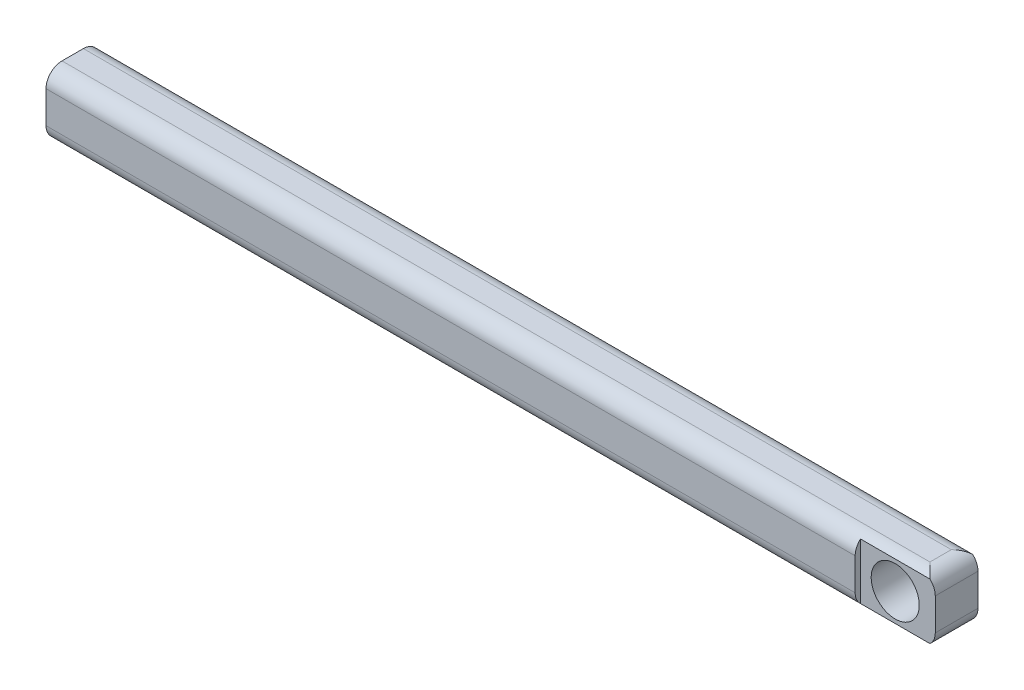
ISO-10303-21;
HEADER;
FILE_DESCRIPTION(('STEP AP214'),'2;1');
FILE_NAME('part.step','',(''),(''),'','','');
FILE_SCHEMA(('AUTOMOTIVE_DESIGN { 1 0 10303 214 1 1 1 1 }'));
ENDSEC;
DATA;
#1=APPLICATION_CONTEXT('core data for automotive mechanical design processes');
#2=APPLICATION_PROTOCOL_DEFINITION('international standard','automotive_design',2000,#1);
#3=PRODUCT_CONTEXT('',#1,'mechanical');
#4=PRODUCT('Part','Part','',(#3));
#5=PRODUCT_RELATED_PRODUCT_CATEGORY('part','',(#4));
#6=PRODUCT_DEFINITION_FORMATION('','',#4);
#7=PRODUCT_DEFINITION_CONTEXT('part definition',#1,'design');
#8=PRODUCT_DEFINITION('design','',#6,#7);
#9=PRODUCT_DEFINITION_SHAPE('','',#8);
#10=(LENGTH_UNIT() NAMED_UNIT(*) SI_UNIT(.MILLI.,.METRE.));
#11=(NAMED_UNIT(*) PLANE_ANGLE_UNIT() SI_UNIT($,.RADIAN.));
#12=(NAMED_UNIT(*) SI_UNIT($,.STERADIAN.) SOLID_ANGLE_UNIT());
#13=UNCERTAINTY_MEASURE_WITH_UNIT(LENGTH_MEASURE(1.E-05),#10,'distance_accuracy_value','');
#14=(GEOMETRIC_REPRESENTATION_CONTEXT(3) GLOBAL_UNCERTAINTY_ASSIGNED_CONTEXT((#13)) GLOBAL_UNIT_ASSIGNED_CONTEXT((#10,
#11,#12)) REPRESENTATION_CONTEXT('',''));
#15=CARTESIAN_POINT('',(0.,0.,0.));
#16=DIRECTION('',(0.,0.,1.));
#17=DIRECTION('',(1.,0.,0.));
#18=AXIS2_PLACEMENT_3D('',#15,#16,#17);
#19=CARTESIAN_POINT('',(0.,0.,12.5));
#20=DIRECTION('',(0.,0.,-1.));
#21=DIRECTION('',(-1.,0.,0.));
#22=AXIS2_PLACEMENT_3D('',#19,#20,#21);
#23=PLANE('',#22);
#24=DIRECTION('',(-1.,0.,0.));
#25=VECTOR('',#24,1.);
#26=CARTESIAN_POINT('',(0.,2.99999999999999,12.5));
#27=LINE('',#26,#25);
#28=CARTESIAN_POINT('',(57.75,2.99999999999999,12.5));
#29=VERTEX_POINT('',#28);
#30=CARTESIAN_POINT('',(-93.75,2.99999999999997,12.5));
#31=VERTEX_POINT('',#30);
#32=EDGE_CURVE('E222',#29,#31,#27,.T.);
#33=ORIENTED_EDGE('',*,*,#32,.T.);
#34=DIRECTION('',(0.,1.,0.));
#35=VECTOR('',#34,1.);
#36=CARTESIAN_POINT('',(-93.75,-3.00000000000003,12.5));
#37=LINE('',#36,#35);
#38=CARTESIAN_POINT('',(-93.75,-3.00000000000003,12.5));
#39=VERTEX_POINT('',#38);
#40=EDGE_CURVE('E167',#39,#31,#37,.T.);
#41=ORIENTED_EDGE('',*,*,#40,.F.);
#42=DIRECTION('',(1.,0.,0.));
#43=VECTOR('',#42,1.);
#44=CARTESIAN_POINT('',(0.,-3.00000000000001,12.5));
#45=LINE('',#44,#43);
#46=CARTESIAN_POINT('',(57.75,-3.,12.5));
#47=VERTEX_POINT('',#46);
#48=EDGE_CURVE('E224',#39,#47,#45,.T.);
#49=ORIENTED_EDGE('',*,*,#48,.T.);
#50=DIRECTION('',(0.,-1.,0.));
#51=VECTOR('',#50,1.);
#52=CARTESIAN_POINT('',(57.75,5.99999999999999,12.5));
#53=LINE('',#52,#51);
#54=EDGE_CURVE('E180',#29,#47,#53,.T.);
#55=ORIENTED_EDGE('',*,*,#54,.F.);
#56=EDGE_LOOP('',(#33,#41,#49,#55));
#57=FACE_BOUND('',#56,.T.);
#58=ADVANCED_FACE('F36',(#57),#23,.F.);
#59=CARTESIAN_POINT('',(0.,0.,2.5));
#60=DIRECTION('',(0.,0.,-1.));
#61=DIRECTION('',(-1.,0.,0.));
#62=AXIS2_PLACEMENT_3D('',#59,#60,#61);
#63=PLANE('',#62);
#64=DIRECTION('',(0.,1.,0.));
#65=VECTOR('',#64,1.);
#66=CARTESIAN_POINT('',(57.75,-6.,2.5));
#67=LINE('',#66,#65);
#68=CARTESIAN_POINT('',(57.75,-3.,2.5));
#69=VERTEX_POINT('',#68);
#70=CARTESIAN_POINT('',(57.75,2.99999999999999,2.5));
#71=VERTEX_POINT('',#70);
#72=EDGE_CURVE('E190',#69,#71,#67,.T.);
#73=ORIENTED_EDGE('',*,*,#72,.F.);
#74=DIRECTION('',(1.,0.,0.));
#75=VECTOR('',#74,1.);
#76=CARTESIAN_POINT('',(53.75,-3.00000000000001,2.5));
#77=LINE('',#76,#75);
#78=CARTESIAN_POINT('',(-93.75,-3.00000000000003,2.5));
#79=VERTEX_POINT('',#78);
#80=EDGE_CURVE('E248',#69,#79,#77,.F.);
#81=ORIENTED_EDGE('',*,*,#80,.T.);
#82=DIRECTION('',(0.,-1.,0.));
#83=VECTOR('',#82,1.);
#84=CARTESIAN_POINT('',(-93.75,2.99999999999997,2.5));
#85=LINE('',#84,#83);
#86=CARTESIAN_POINT('',(-93.75,2.99999999999997,2.5));
#87=VERTEX_POINT('',#86);
#88=EDGE_CURVE('E163',#87,#79,#85,.T.);
#89=ORIENTED_EDGE('',*,*,#88,.F.);
#90=DIRECTION('',(-1.,0.,0.));
#91=VECTOR('',#90,1.);
#92=CARTESIAN_POINT('',(57.75,2.99999999999999,2.5));
#93=LINE('',#92,#91);
#94=EDGE_CURVE('E246',#87,#71,#93,.F.);
#95=ORIENTED_EDGE('',*,*,#94,.T.);
#96=EDGE_LOOP('',(#73,#81,#89,#95));
#97=FACE_BOUND('',#96,.T.);
#98=ADVANCED_FACE('F282',(#97),#63,.T.);
#99=CARTESIAN_POINT('',(71.75,-6.,12.5));
#100=DIRECTION('',(0.,1.,0.));
#101=DIRECTION('',(-1.,0.,0.));
#102=AXIS2_PLACEMENT_3D('',#99,#100,#101);
#103=PLANE('',#102);
#104=DIRECTION('',(0.,0.,-1.));
#105=VECTOR('',#104,1.);
#106=CARTESIAN_POINT('',(68.75,-6.,12.5));
#107=LINE('',#106,#105);
#108=CARTESIAN_POINT('',(68.75,-6.,5.5));
#109=VERTEX_POINT('',#108);
#110=CARTESIAN_POINT('',(68.75,-6.,9.5));
#111=VERTEX_POINT('',#110);
#112=EDGE_CURVE('E213',#109,#111,#107,.F.);
#113=ORIENTED_EDGE('',*,*,#112,.T.);
#114=DIRECTION('',(1.,0.,0.));
#115=VECTOR('',#114,1.);
#116=CARTESIAN_POINT('',(71.75,-6.,9.5));
#117=LINE('',#116,#115);
#118=CARTESIAN_POINT('',(-93.75,-6.00000000000003,9.5));
#119=VERTEX_POINT('',#118);
#120=EDGE_CURVE('E147',#111,#119,#117,.F.);
#121=ORIENTED_EDGE('',*,*,#120,.T.);
#122=DIRECTION('',(0.,0.,1.));
#123=VECTOR('',#122,1.);
#124=CARTESIAN_POINT('',(-93.75,-6.00000000000003,5.5));
#125=LINE('',#124,#123);
#126=CARTESIAN_POINT('',(-93.75,-6.00000000000003,5.5));
#127=VERTEX_POINT('',#126);
#128=EDGE_CURVE('E151',#127,#119,#125,.T.);
#129=ORIENTED_EDGE('',*,*,#128,.F.);
#130=DIRECTION('',(1.,0.,0.));
#131=VECTOR('',#130,1.);
#132=CARTESIAN_POINT('',(57.75,-6.00000000000001,5.5));
#133=LINE('',#132,#131);
#134=EDGE_CURVE('E136',#127,#109,#133,.T.);
#135=ORIENTED_EDGE('',*,*,#134,.T.);
#136=EDGE_LOOP('',(#113,#121,#129,#135));
#137=FACE_BOUND('',#136,.T.);
#138=ADVANCED_FACE('F152',(#137),#103,.F.);
#139=CARTESIAN_POINT('',(71.75,5.99999999999999,12.5));
#140=DIRECTION('',(-1.,0.,0.));
#141=DIRECTION('',(0.,0.,1.));
#142=AXIS2_PLACEMENT_3D('',#139,#140,#141);
#143=PLANE('',#142);
#144=DIRECTION('',(0.,1.,0.));
#145=VECTOR('',#144,1.);
#146=CARTESIAN_POINT('',(71.75,5.99999999999999,11.5));
#147=LINE('',#146,#145);
#148=CARTESIAN_POINT('',(71.75,-3.,11.5));
#149=VERTEX_POINT('',#148);
#150=CARTESIAN_POINT('',(71.75,2.99999999999999,11.5));
#151=VERTEX_POINT('',#150);
#152=EDGE_CURVE('E184',#149,#151,#147,.T.);
#153=ORIENTED_EDGE('',*,*,#152,.F.);
#154=DIRECTION('',(0.,0.,-1.));
#155=VECTOR('',#154,1.);
#156=CARTESIAN_POINT('',(71.75,-3.,12.5));
#157=LINE('',#156,#155);
#158=CARTESIAN_POINT('',(71.75,-3.,3.5));
#159=VERTEX_POINT('',#158);
#160=EDGE_CURVE('E205',#149,#159,#157,.T.);
#161=ORIENTED_EDGE('',*,*,#160,.T.);
#162=DIRECTION('',(0.,-1.,0.));
#163=VECTOR('',#162,1.);
#164=CARTESIAN_POINT('',(71.75,5.99999999999999,3.5));
#165=LINE('',#164,#163);
#166=CARTESIAN_POINT('',(71.75,2.99999999999999,3.5));
#167=VERTEX_POINT('',#166);
#168=EDGE_CURVE('E179',#167,#159,#165,.T.);
#169=ORIENTED_EDGE('',*,*,#168,.F.);
#170=DIRECTION('',(0.,0.,-1.));
#171=VECTOR('',#170,1.);
#172=CARTESIAN_POINT('',(71.75,2.99999999999999,12.5));
#173=LINE('',#172,#171);
#174=EDGE_CURVE('E203',#167,#151,#173,.F.);
#175=ORIENTED_EDGE('',*,*,#174,.T.);
#176=EDGE_LOOP('',(#153,#161,#169,#175));
#177=FACE_BOUND('',#176,.T.);
#178=ADVANCED_FACE('F295',(#177),#143,.F.);
#179=CARTESIAN_POINT('',(53.75,5.99999999999999,12.5));
#180=DIRECTION('',(0.,-1.,0.));
#181=DIRECTION('',(0.,0.,-1.));
#182=AXIS2_PLACEMENT_3D('',#179,#180,#181);
#183=PLANE('',#182);
#184=DIRECTION('',(0.,0.,-1.));
#185=VECTOR('',#184,1.);
#186=CARTESIAN_POINT('',(68.75,5.99999999999999,12.5));
#187=LINE('',#186,#185);
#188=CARTESIAN_POINT('',(68.75,5.99999999999999,9.5));
#189=VERTEX_POINT('',#188);
#190=CARTESIAN_POINT('',(68.75,5.99999999999999,5.5));
#191=VERTEX_POINT('',#190);
#192=EDGE_CURVE('E220',#189,#191,#187,.T.);
#193=ORIENTED_EDGE('',*,*,#192,.T.);
#194=DIRECTION('',(-1.,0.,0.));
#195=VECTOR('',#194,1.);
#196=CARTESIAN_POINT('',(53.75,5.99999999999999,5.5));
#197=LINE('',#196,#195);
#198=CARTESIAN_POINT('',(-93.75,5.99999999999997,5.5));
#199=VERTEX_POINT('',#198);
#200=EDGE_CURVE('E251',#191,#199,#197,.T.);
#201=ORIENTED_EDGE('',*,*,#200,.T.);
#202=DIRECTION('',(0.,0.,-1.));
#203=VECTOR('',#202,1.);
#204=CARTESIAN_POINT('',(-93.75,5.99999999999997,9.5));
#205=LINE('',#204,#203);
#206=CARTESIAN_POINT('',(-93.75,5.99999999999997,9.5));
#207=VERTEX_POINT('',#206);
#208=EDGE_CURVE('E173',#207,#199,#205,.T.);
#209=ORIENTED_EDGE('',*,*,#208,.F.);
#210=DIRECTION('',(-1.,0.,0.));
#211=VECTOR('',#210,1.);
#212=CARTESIAN_POINT('',(53.75,5.99999999999999,9.5));
#213=LINE('',#212,#211);
#214=EDGE_CURVE('E56',#207,#189,#213,.F.);
#215=ORIENTED_EDGE('',*,*,#214,.T.);
#216=EDGE_LOOP('',(#193,#201,#209,#215));
#217=FACE_BOUND('',#216,.T.);
#218=ADVANCED_FACE('F274',(#217),#183,.F.);
#219=CARTESIAN_POINT('',(57.75,5.99999999999999,3.5));
#220=DIRECTION('',(0.,0.,1.));
#221=DIRECTION('',(0.,-1.,0.));
#222=AXIS2_PLACEMENT_3D('',#219,#220,#221);
#223=PLANE('',#222);
#224=CARTESIAN_POINT('',(64.25,0.,3.5));
#225=DIRECTION('',(0.,0.,1.));
#226=DIRECTION('',(0.,-1.,0.));
#227=AXIS2_PLACEMENT_3D('',#224,#225,#226);
#228=CIRCLE('',#227,4.5);
#229=CARTESIAN_POINT('',(64.25,-4.5,3.5));
#230=VERTEX_POINT('',#229);
#231=EDGE_CURVE('E187',#230,#230,#228,.T.);
#232=ORIENTED_EDGE('',*,*,#231,.T.);
#233=EDGE_LOOP('',(#232));
#234=FACE_BOUND('',#233,.T.);
#235=CARTESIAN_POINT('',(68.75,-3.,3.5));
#236=DIRECTION('',(0.,0.,1.));
#237=DIRECTION('',(0.,-1.,0.));
#238=AXIS2_PLACEMENT_3D('',#235,#236,#237);
#239=CIRCLE('',#238,3.);
#240=CARTESIAN_POINT('',(70.75,-5.23606797749979,3.5));
#241=VERTEX_POINT('',#240);
#242=EDGE_CURVE('E210',#159,#241,#239,.F.);
#243=ORIENTED_EDGE('',*,*,#242,.T.);
#244=DIRECTION('',(-1.,0.,0.));
#245=VECTOR('',#244,1.);
#246=CARTESIAN_POINT('',(70.75,-5.23606797749979,3.5));
#247=LINE('',#246,#245);
#248=CARTESIAN_POINT('',(57.75,-5.23606797749979,3.5));
#249=VERTEX_POINT('',#248);
#250=EDGE_CURVE('E240',#241,#249,#247,.T.);
#251=ORIENTED_EDGE('',*,*,#250,.T.);
#252=DIRECTION('',(0.,-1.,0.));
#253=VECTOR('',#252,1.);
#254=CARTESIAN_POINT('',(57.75,5.99999999999999,3.5));
#255=LINE('',#254,#253);
#256=CARTESIAN_POINT('',(57.75,5.23606797749978,3.5));
#257=VERTEX_POINT('',#256);
#258=EDGE_CURVE('E191',#257,#249,#255,.T.);
#259=ORIENTED_EDGE('',*,*,#258,.F.);
#260=DIRECTION('',(1.,0.,0.));
#261=VECTOR('',#260,1.);
#262=CARTESIAN_POINT('',(57.75,5.23606797749978,3.5));
#263=LINE('',#262,#261);
#264=CARTESIAN_POINT('',(70.75,5.23606797749978,3.5));
#265=VERTEX_POINT('',#264);
#266=EDGE_CURVE('E238',#257,#265,#263,.T.);
#267=ORIENTED_EDGE('',*,*,#266,.T.);
#268=CARTESIAN_POINT('',(68.75,2.99999999999999,3.5));
#269=DIRECTION('',(0.,0.,1.));
#270=DIRECTION('',(0.,-1.,0.));
#271=AXIS2_PLACEMENT_3D('',#268,#269,#270);
#272=CIRCLE('',#271,3.);
#273=EDGE_CURVE('E208',#265,#167,#272,.F.);
#274=ORIENTED_EDGE('',*,*,#273,.T.);
#275=ORIENTED_EDGE('',*,*,#168,.T.);
#276=EDGE_LOOP('',(#243,#251,#259,#267,#274,#275));
#277=FACE_BOUND('',#276,.T.);
#278=ADVANCED_FACE('F288',(#234,#277),#223,.F.);
#279=CARTESIAN_POINT('',(57.75,0.,0.));
#280=DIRECTION('',(1.,0.,0.));
#281=DIRECTION('',(0.,0.,-1.));
#282=AXIS2_PLACEMENT_3D('',#279,#280,#281);
#283=PLANE('',#282);
#284=ORIENTED_EDGE('',*,*,#258,.T.);
#285=CARTESIAN_POINT('',(57.75,-3.,5.5));
#286=DIRECTION('',(1.,0.,0.));
#287=DIRECTION('',(0.,0.,-1.));
#288=AXIS2_PLACEMENT_3D('',#285,#286,#287);
#289=CIRCLE('',#288,3.);
#290=EDGE_CURVE('E244',#249,#69,#289,.T.);
#291=ORIENTED_EDGE('',*,*,#290,.T.);
#292=ORIENTED_EDGE('',*,*,#72,.T.);
#293=CARTESIAN_POINT('',(57.75,2.99999999999999,5.5));
#294=DIRECTION('',(1.,0.,0.));
#295=DIRECTION('',(0.,0.,-1.));
#296=AXIS2_PLACEMENT_3D('',#293,#294,#295);
#297=CIRCLE('',#296,3.);
#298=EDGE_CURVE('E242',#71,#257,#297,.T.);
#299=ORIENTED_EDGE('',*,*,#298,.T.);
#300=EDGE_LOOP('',(#284,#291,#292,#299));
#301=FACE_BOUND('',#300,.T.);
#302=ADVANCED_FACE('F285',(#301),#283,.T.);
#303=CARTESIAN_POINT('',(57.75,5.99999999999999,11.5));
#304=DIRECTION('',(0.,0.,-1.));
#305=DIRECTION('',(0.,1.,0.));
#306=AXIS2_PLACEMENT_3D('',#303,#304,#305);
#307=PLANE('',#306);
#308=CARTESIAN_POINT('',(64.25,0.,11.5));
#309=DIRECTION('',(0.,0.,-1.));
#310=DIRECTION('',(0.,1.,0.));
#311=AXIS2_PLACEMENT_3D('',#308,#309,#310);
#312=CIRCLE('',#311,4.5);
#313=CARTESIAN_POINT('',(64.25,4.5,11.5));
#314=VERTEX_POINT('',#313);
#315=EDGE_CURVE('E200',#314,#314,#312,.T.);
#316=ORIENTED_EDGE('',*,*,#315,.T.);
#317=EDGE_LOOP('',(#316));
#318=FACE_BOUND('',#317,.T.);
#319=DIRECTION('',(0.,1.,0.));
#320=VECTOR('',#319,1.);
#321=CARTESIAN_POINT('',(57.75,5.99999999999999,11.5));
#322=LINE('',#321,#320);
#323=CARTESIAN_POINT('',(57.75,-5.2360679774998,11.5));
#324=VERTEX_POINT('',#323);
#325=CARTESIAN_POINT('',(57.75,5.23606797749979,11.5));
#326=VERTEX_POINT('',#325);
#327=EDGE_CURVE('E183',#324,#326,#322,.T.);
#328=ORIENTED_EDGE('',*,*,#327,.F.);
#329=DIRECTION('',(1.,0.,0.));
#330=VECTOR('',#329,1.);
#331=CARTESIAN_POINT('',(57.75,-5.2360679774998,11.5));
#332=LINE('',#331,#330);
#333=CARTESIAN_POINT('',(70.75,-5.23606797749979,11.5));
#334=VERTEX_POINT('',#333);
#335=EDGE_CURVE('E233',#324,#334,#332,.T.);
#336=ORIENTED_EDGE('',*,*,#335,.T.);
#337=CARTESIAN_POINT('',(68.75,-3.,11.5));
#338=DIRECTION('',(0.,0.,-1.));
#339=DIRECTION('',(0.,1.,0.));
#340=AXIS2_PLACEMENT_3D('',#337,#338,#339);
#341=CIRCLE('',#340,3.);
#342=EDGE_CURVE('E218',#334,#149,#341,.F.);
#343=ORIENTED_EDGE('',*,*,#342,.T.);
#344=ORIENTED_EDGE('',*,*,#152,.T.);
#345=CARTESIAN_POINT('',(68.75,2.99999999999999,11.5));
#346=DIRECTION('',(0.,0.,-1.));
#347=DIRECTION('',(0.,1.,0.));
#348=AXIS2_PLACEMENT_3D('',#345,#346,#347);
#349=CIRCLE('',#348,3.);
#350=CARTESIAN_POINT('',(70.75,5.23606797749978,11.5));
#351=VERTEX_POINT('',#350);
#352=EDGE_CURVE('E215',#151,#351,#349,.F.);
#353=ORIENTED_EDGE('',*,*,#352,.T.);
#354=DIRECTION('',(-1.,0.,0.));
#355=VECTOR('',#354,1.);
#356=CARTESIAN_POINT('',(70.75,5.23606797749979,11.5));
#357=LINE('',#356,#355);
#358=EDGE_CURVE('E231',#351,#326,#357,.T.);
#359=ORIENTED_EDGE('',*,*,#358,.T.);
#360=EDGE_LOOP('',(#328,#336,#343,#344,#353,#359));
#361=FACE_BOUND('',#360,.T.);
#362=ADVANCED_FACE('F260',(#318,#361),#307,.F.);
#363=CARTESIAN_POINT('',(57.75,0.,0.));
#364=DIRECTION('',(1.,0.,0.));
#365=DIRECTION('',(0.,0.,-1.));
#366=AXIS2_PLACEMENT_3D('',#363,#364,#365);
#367=PLANE('',#366);
#368=ORIENTED_EDGE('',*,*,#54,.T.);
#369=CARTESIAN_POINT('',(57.75,-3.,9.5));
#370=DIRECTION('',(1.,0.,0.));
#371=DIRECTION('',(0.,0.,-1.));
#372=AXIS2_PLACEMENT_3D('',#369,#370,#371);
#373=CIRCLE('',#372,3.);
#374=EDGE_CURVE('E229',#47,#324,#373,.T.);
#375=ORIENTED_EDGE('',*,*,#374,.T.);
#376=ORIENTED_EDGE('',*,*,#327,.T.);
#377=CARTESIAN_POINT('',(57.75,2.99999999999999,9.5));
#378=DIRECTION('',(1.,0.,0.));
#379=DIRECTION('',(0.,0.,-1.));
#380=AXIS2_PLACEMENT_3D('',#377,#378,#379);
#381=CIRCLE('',#380,3.);
#382=EDGE_CURVE('E227',#326,#29,#381,.T.);
#383=ORIENTED_EDGE('',*,*,#382,.T.);
#384=EDGE_LOOP('',(#368,#375,#376,#383));
#385=FACE_BOUND('',#384,.T.);
#386=ADVANCED_FACE('F267',(#385),#367,.T.);
#387=CARTESIAN_POINT('',(64.25,0.,12.5));
#388=DIRECTION('',(0.,0.,-1.));
#389=DIRECTION('',(-1.,0.,0.));
#390=AXIS2_PLACEMENT_3D('',#387,#388,#389);
#391=CYLINDRICAL_SURFACE('',#390,4.5);
#392=ORIENTED_EDGE('',*,*,#315,.F.);
#393=EDGE_LOOP('',(#392));
#394=FACE_BOUND('',#393,.T.);
#395=ORIENTED_EDGE('',*,*,#231,.F.);
#396=EDGE_LOOP('',(#395));
#397=FACE_BOUND('',#396,.T.);
#398=ADVANCED_FACE('F313',(#394,#397),#391,.F.);
#399=CARTESIAN_POINT('',(68.75,-3.,12.5));
#400=DIRECTION('',(0.,0.,-1.));
#401=DIRECTION('',(-1.,0.,0.));
#402=AXIS2_PLACEMENT_3D('',#399,#400,#401);
#403=CYLINDRICAL_SURFACE('',#402,3.);
#404=ORIENTED_EDGE('',*,*,#342,.F.);
#405=CARTESIAN_POINT('',(68.75,-3.,9.5));
#406=DIRECTION('',(0.707106781186547,0.,-0.707106781186547));
#407=DIRECTION('',(-0.707106781186547,0.,-0.707106781186547));
#408=AXIS2_PLACEMENT_3D('',#405,#406,#407);
#409=ELLIPSE('',#408,4.24264068711928,3.);
#410=EDGE_CURVE('E148',#334,#111,#409,.T.);
#411=ORIENTED_EDGE('',*,*,#410,.T.);
#412=ORIENTED_EDGE('',*,*,#112,.F.);
#413=CARTESIAN_POINT('',(68.75,-3.,5.5));
#414=DIRECTION('',(-0.707106781186547,0.,-0.707106781186547));
#415=DIRECTION('',(0.707106781186547,0.,-0.707106781186547));
#416=AXIS2_PLACEMENT_3D('',#413,#414,#415);
#417=ELLIPSE('',#416,4.24264068711928,3.);
#418=EDGE_CURVE('E143',#109,#241,#417,.F.);
#419=ORIENTED_EDGE('',*,*,#418,.T.);
#420=ORIENTED_EDGE('',*,*,#242,.F.);
#421=ORIENTED_EDGE('',*,*,#160,.F.);
#422=EDGE_LOOP('',(#404,#411,#412,#419,#420,#421));
#423=FACE_BOUND('',#422,.T.);
#424=ADVANCED_FACE('F293',(#423),#403,.T.);
#425=CARTESIAN_POINT('',(68.75,2.99999999999999,12.5));
#426=DIRECTION('',(0.,0.,-1.));
#427=DIRECTION('',(-1.,0.,0.));
#428=AXIS2_PLACEMENT_3D('',#425,#426,#427);
#429=CYLINDRICAL_SURFACE('',#428,3.);
#430=ORIENTED_EDGE('',*,*,#273,.F.);
#431=CARTESIAN_POINT('',(68.75,2.99999999999999,5.5));
#432=DIRECTION('',(-0.707106781186547,0.,-0.707106781186547));
#433=DIRECTION('',(0.707106781186547,0.,-0.707106781186547));
#434=AXIS2_PLACEMENT_3D('',#431,#432,#433);
#435=ELLIPSE('',#434,4.24264068711928,3.);
#436=EDGE_CURVE('E12',#265,#191,#435,.F.);
#437=ORIENTED_EDGE('',*,*,#436,.T.);
#438=ORIENTED_EDGE('',*,*,#192,.F.);
#439=CARTESIAN_POINT('',(68.75,2.99999999999999,9.5));
#440=DIRECTION('',(0.707106781186547,0.,-0.707106781186547));
#441=DIRECTION('',(-0.707106781186547,0.,-0.707106781186547));
#442=AXIS2_PLACEMENT_3D('',#439,#440,#441);
#443=ELLIPSE('',#442,4.24264068711928,3.);
#444=EDGE_CURVE('E44',#189,#351,#443,.T.);
#445=ORIENTED_EDGE('',*,*,#444,.T.);
#446=ORIENTED_EDGE('',*,*,#352,.F.);
#447=ORIENTED_EDGE('',*,*,#174,.F.);
#448=EDGE_LOOP('',(#430,#437,#438,#445,#446,#447));
#449=FACE_BOUND('',#448,.T.);
#450=ADVANCED_FACE('F254',(#449),#429,.T.);
#451=CARTESIAN_POINT('',(0.,-3.00000000000001,9.5));
#452=DIRECTION('',(1.,0.,0.));
#453=DIRECTION('',(0.,1.,0.));
#454=AXIS2_PLACEMENT_3D('',#451,#452,#453);
#455=CYLINDRICAL_SURFACE('',#454,3.);
#456=ORIENTED_EDGE('',*,*,#48,.F.);
#457=CARTESIAN_POINT('',(-93.75,-3.00000000000003,9.5));
#458=DIRECTION('',(-1.,0.,0.));
#459=DIRECTION('',(0.,-1.,0.));
#460=AXIS2_PLACEMENT_3D('',#457,#458,#459);
#461=CIRCLE('',#460,3.);
#462=EDGE_CURVE('E157',#119,#39,#461,.T.);
#463=ORIENTED_EDGE('',*,*,#462,.F.);
#464=ORIENTED_EDGE('',*,*,#120,.F.);
#465=ORIENTED_EDGE('',*,*,#410,.F.);
#466=ORIENTED_EDGE('',*,*,#335,.F.);
#467=ORIENTED_EDGE('',*,*,#374,.F.);
#468=EDGE_LOOP('',(#456,#463,#464,#465,#466,#467));
#469=FACE_BOUND('',#468,.T.);
#470=ADVANCED_FACE('F271',(#469),#455,.T.);
#471=CARTESIAN_POINT('',(71.75,-3.,5.5));
#472=DIRECTION('',(-1.,0.,0.));
#473=DIRECTION('',(0.,-1.,0.));
#474=AXIS2_PLACEMENT_3D('',#471,#472,#473);
#475=CYLINDRICAL_SURFACE('',#474,3.);
#476=ORIENTED_EDGE('',*,*,#134,.F.);
#477=CARTESIAN_POINT('',(-93.75,-3.00000000000003,5.5));
#478=DIRECTION('',(-1.,0.,0.));
#479=DIRECTION('',(0.,-1.,0.));
#480=AXIS2_PLACEMENT_3D('',#477,#478,#479);
#481=CIRCLE('',#480,3.);
#482=EDGE_CURVE('E141',#79,#127,#481,.T.);
#483=ORIENTED_EDGE('',*,*,#482,.F.);
#484=ORIENTED_EDGE('',*,*,#80,.F.);
#485=ORIENTED_EDGE('',*,*,#290,.F.);
#486=ORIENTED_EDGE('',*,*,#250,.F.);
#487=ORIENTED_EDGE('',*,*,#418,.F.);
#488=EDGE_LOOP('',(#476,#483,#484,#485,#486,#487));
#489=FACE_BOUND('',#488,.T.);
#490=ADVANCED_FACE('F138',(#489),#475,.T.);
#491=CARTESIAN_POINT('',(53.75,2.99999999999999,5.5));
#492=DIRECTION('',(1.,0.,0.));
#493=DIRECTION('',(0.,0.,-1.));
#494=AXIS2_PLACEMENT_3D('',#491,#492,#493);
#495=CYLINDRICAL_SURFACE('',#494,3.);
#496=ORIENTED_EDGE('',*,*,#298,.F.);
#497=ORIENTED_EDGE('',*,*,#94,.F.);
#498=CARTESIAN_POINT('',(-93.75,2.99999999999997,5.5));
#499=DIRECTION('',(-1.,0.,0.));
#500=DIRECTION('',(0.,-1.,0.));
#501=AXIS2_PLACEMENT_3D('',#498,#499,#500);
#502=CIRCLE('',#501,3.);
#503=EDGE_CURVE('E176',#199,#87,#502,.T.);
#504=ORIENTED_EDGE('',*,*,#503,.F.);
#505=ORIENTED_EDGE('',*,*,#200,.F.);
#506=ORIENTED_EDGE('',*,*,#436,.F.);
#507=ORIENTED_EDGE('',*,*,#266,.F.);
#508=EDGE_LOOP('',(#496,#497,#504,#505,#506,#507));
#509=FACE_BOUND('',#508,.T.);
#510=ADVANCED_FACE('F278',(#509),#495,.T.);
#511=CARTESIAN_POINT('',(0.,2.99999999999999,9.5));
#512=DIRECTION('',(-1.,0.,0.));
#513=DIRECTION('',(0.,0.,1.));
#514=AXIS2_PLACEMENT_3D('',#511,#512,#513);
#515=CYLINDRICAL_SURFACE('',#514,3.);
#516=ORIENTED_EDGE('',*,*,#444,.F.);
#517=ORIENTED_EDGE('',*,*,#214,.F.);
#518=CARTESIAN_POINT('',(-93.75,2.99999999999997,9.5));
#519=DIRECTION('',(-1.,0.,0.));
#520=DIRECTION('',(0.,-1.,0.));
#521=AXIS2_PLACEMENT_3D('',#518,#519,#520);
#522=CIRCLE('',#521,3.);
#523=EDGE_CURVE('E170',#31,#207,#522,.T.);
#524=ORIENTED_EDGE('',*,*,#523,.F.);
#525=ORIENTED_EDGE('',*,*,#32,.F.);
#526=ORIENTED_EDGE('',*,*,#382,.F.);
#527=ORIENTED_EDGE('',*,*,#358,.F.);
#528=EDGE_LOOP('',(#516,#517,#524,#525,#526,#527));
#529=FACE_BOUND('',#528,.T.);
#530=ADVANCED_FACE('F38',(#529),#515,.T.);
#531=CARTESIAN_POINT('',(-93.75,-3.00000000000003,5.5));
#532=DIRECTION('',(-1.,0.,0.));
#533=DIRECTION('',(0.,-1.,0.));
#534=AXIS2_PLACEMENT_3D('',#531,#532,#533);
#535=PLANE('',#534);
#536=ORIENTED_EDGE('',*,*,#482,.T.);
#537=ORIENTED_EDGE('',*,*,#128,.T.);
#538=ORIENTED_EDGE('',*,*,#462,.T.);
#539=ORIENTED_EDGE('',*,*,#40,.T.);
#540=ORIENTED_EDGE('',*,*,#523,.T.);
#541=ORIENTED_EDGE('',*,*,#208,.T.);
#542=ORIENTED_EDGE('',*,*,#503,.T.);
#543=ORIENTED_EDGE('',*,*,#88,.T.);
#544=EDGE_LOOP('',(#536,#537,#538,#539,#540,#541,#542,#543));
#545=FACE_BOUND('',#544,.T.);
#546=ADVANCED_FACE('F160',(#545),#535,.T.);
#547=CLOSED_SHELL('',(#58,#98,#138,#178,#218,#278,#302,#362,#386,#398,#424,#450,#470,#490,#510,
#530,#546));
#548=MANIFOLD_SOLID_BREP('B2',#547);
#549=ADVANCED_BREP_SHAPE_REPRESENTATION('',(#18,#548),#14);
#550=SHAPE_DEFINITION_REPRESENTATION(#9,#549);
ENDSEC;
END-ISO-10303-21;
